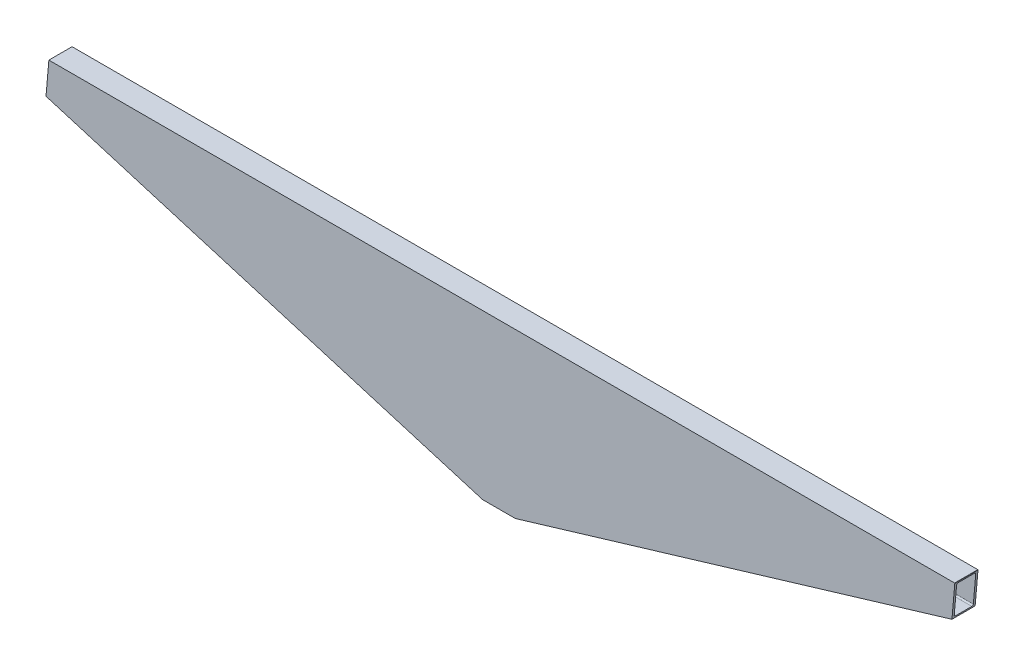
ISO-10303-21;
HEADER;
FILE_DESCRIPTION(('STEP AP214'),'2;1');
FILE_NAME('part.step','',(''),(''),'','','');
FILE_SCHEMA(('AUTOMOTIVE_DESIGN { 1 0 10303 214 1 1 1 1 }'));
ENDSEC;
DATA;
#1=APPLICATION_CONTEXT('core data for automotive mechanical design processes');
#2=APPLICATION_PROTOCOL_DEFINITION('international standard','automotive_design',2000,#1);
#3=PRODUCT_CONTEXT('',#1,'mechanical');
#4=PRODUCT('Part','Part','',(#3));
#5=PRODUCT_RELATED_PRODUCT_CATEGORY('part','',(#4));
#6=PRODUCT_DEFINITION_FORMATION('','',#4);
#7=PRODUCT_DEFINITION_CONTEXT('part definition',#1,'design');
#8=PRODUCT_DEFINITION('design','',#6,#7);
#9=PRODUCT_DEFINITION_SHAPE('','',#8);
#10=(LENGTH_UNIT() NAMED_UNIT(*) SI_UNIT(.MILLI.,.METRE.));
#11=(NAMED_UNIT(*) PLANE_ANGLE_UNIT() SI_UNIT($,.RADIAN.));
#12=(NAMED_UNIT(*) SI_UNIT($,.STERADIAN.) SOLID_ANGLE_UNIT());
#13=UNCERTAINTY_MEASURE_WITH_UNIT(LENGTH_MEASURE(1.E-05),#10,'distance_accuracy_value','');
#14=(GEOMETRIC_REPRESENTATION_CONTEXT(3) GLOBAL_UNCERTAINTY_ASSIGNED_CONTEXT((#13)) GLOBAL_UNIT_ASSIGNED_CONTEXT((#10,
#11,#12)) REPRESENTATION_CONTEXT('',''));
#15=CARTESIAN_POINT('',(0.,0.,0.));
#16=DIRECTION('',(0.,0.,1.));
#17=DIRECTION('',(1.,0.,0.));
#18=AXIS2_PLACEMENT_3D('',#15,#16,#17);
#19=CARTESIAN_POINT('',(4214.8777653,0.,0.));
#20=DIRECTION('',(0.,1.,0.));
#21=DIRECTION('',(0.,0.,1.));
#22=AXIS2_PLACEMENT_3D('',#19,#20,#21);
#23=PLANE('',#22);
#24=DIRECTION('',(0.,0.,-1.));
#25=VECTOR('',#24,1.);
#26=CARTESIAN_POINT('',(2017.90561032865,0.,101.6));
#27=LINE('',#26,#25);
#28=CARTESIAN_POINT('',(2017.90561032865,0.,101.6));
#29=VERTEX_POINT('',#28);
#30=CARTESIAN_POINT('',(2017.90561032865,0.,0.));
#31=VERTEX_POINT('',#30);
#32=EDGE_CURVE('E350',#29,#31,#27,.T.);
#33=ORIENTED_EDGE('',*,*,#32,.F.);
#34=DIRECTION('',(-1.,0.,0.));
#35=VECTOR('',#34,1.);
#36=CARTESIAN_POINT('',(4214.8777653,0.,101.6));
#37=LINE('',#36,#35);
#38=CARTESIAN_POINT('',(-13.3332723213508,0.,101.6));
#39=VERTEX_POINT('',#38);
#40=EDGE_CURVE('E434',#29,#39,#37,.T.);
#41=ORIENTED_EDGE('',*,*,#40,.T.);
#42=DIRECTION('',(0.,0.,-1.));
#43=VECTOR('',#42,1.);
#44=CARTESIAN_POINT('',(-13.3332723213509,0.,0.));
#45=LINE('',#44,#43);
#46=CARTESIAN_POINT('',(-13.3332723213509,0.,0.));
#47=VERTEX_POINT('',#46);
#48=EDGE_CURVE('E392',#39,#47,#45,.T.);
#49=ORIENTED_EDGE('',*,*,#48,.T.);
#50=DIRECTION('',(-1.,0.,0.));
#51=VECTOR('',#50,1.);
#52=CARTESIAN_POINT('',(4214.8777653,0.,0.));
#53=LINE('',#52,#51);
#54=EDGE_CURVE('E56',#31,#47,#53,.T.);
#55=ORIENTED_EDGE('',*,*,#54,.F.);
#56=EDGE_LOOP('',(#33,#41,#49,#55));
#57=FACE_BOUND('',#56,.T.);
#58=ADVANCED_FACE('F33',(#57),#23,.F.);
#59=DIRECTION('',(0.,0.,1.));
#60=VECTOR('',#59,1.);
#61=CARTESIAN_POINT('',(2170.30561032865,0.,101.6));
#62=LINE('',#61,#60);
#63=CARTESIAN_POINT('',(2170.30561032865,0.,0.));
#64=VERTEX_POINT('',#63);
#65=CARTESIAN_POINT('',(2170.30561032865,0.,101.6));
#66=VERTEX_POINT('',#65);
#67=EDGE_CURVE('E354',#64,#66,#62,.T.);
#68=ORIENTED_EDGE('',*,*,#67,.F.);
#69=CARTESIAN_POINT('',(4201.54449297865,0.,0.));
#70=VERTEX_POINT('',#69);
#71=EDGE_CURVE('E431',#70,#64,#53,.T.);
#72=ORIENTED_EDGE('',*,*,#71,.F.);
#73=DIRECTION('',(0.,0.,1.));
#74=VECTOR('',#73,1.);
#75=CARTESIAN_POINT('',(4201.54449297865,0.,0.));
#76=LINE('',#75,#74);
#77=CARTESIAN_POINT('',(4201.54449297865,0.,101.6));
#78=VERTEX_POINT('',#77);
#79=EDGE_CURVE('E394',#70,#78,#76,.T.);
#80=ORIENTED_EDGE('',*,*,#79,.T.);
#81=EDGE_CURVE('E435',#78,#66,#37,.T.);
#82=ORIENTED_EDGE('',*,*,#81,.T.);
#83=EDGE_LOOP('',(#68,#72,#80,#82));
#84=FACE_BOUND('',#83,.T.);
#85=ADVANCED_FACE('F468',(#84),#23,.F.);
#86=CARTESIAN_POINT('',(4214.8777653,152.4,0.));
#87=DIRECTION('',(0.,-1.,0.));
#88=DIRECTION('',(0.,0.,-1.));
#89=AXIS2_PLACEMENT_3D('',#86,#87,#88);
#90=PLANE('',#89);
#91=DIRECTION('',(0.,0.,1.));
#92=VECTOR('',#91,1.);
#93=CARTESIAN_POINT('',(0.,152.4,0.));
#94=LINE('',#93,#92);
#95=CARTESIAN_POINT('',(0.,152.4,-3.175));
#96=VERTEX_POINT('',#95);
#97=CARTESIAN_POINT('',(0.,152.4,104.775));
#98=VERTEX_POINT('',#97);
#99=EDGE_CURVE('E429',#96,#98,#94,.T.);
#100=ORIENTED_EDGE('',*,*,#99,.T.);
#101=DIRECTION('',(-1.,0.,0.));
#102=VECTOR('',#101,1.);
#103=CARTESIAN_POINT('',(4213.78645679893,152.4,104.775));
#104=LINE('',#103,#102);
#105=CARTESIAN_POINT('',(4213.78645679893,152.4,104.775));
#106=VERTEX_POINT('',#105);
#107=EDGE_CURVE('E455',#106,#98,#104,.T.);
#108=ORIENTED_EDGE('',*,*,#107,.F.);
#109=DIRECTION('',(0.,0.,1.));
#110=VECTOR('',#109,1.);
#111=CARTESIAN_POINT('',(4213.78645679893,152.4,0.));
#112=LINE('',#111,#110);
#113=CARTESIAN_POINT('',(4213.78645679893,152.4,-3.175));
#114=VERTEX_POINT('',#113);
#115=EDGE_CURVE('E11',#106,#114,#112,.F.);
#116=ORIENTED_EDGE('',*,*,#115,.T.);
#117=DIRECTION('',(1.,0.,0.));
#118=VECTOR('',#117,1.);
#119=CARTESIAN_POINT('',(0.,152.4,-3.175));
#120=LINE('',#119,#118);
#121=EDGE_CURVE('E271',#96,#114,#120,.T.);
#122=ORIENTED_EDGE('',*,*,#121,.F.);
#123=EDGE_LOOP('',(#100,#108,#116,#122));
#124=FACE_BOUND('',#123,.T.);
#125=ADVANCED_FACE('F486',(#124),#90,.F.);
#126=CARTESIAN_POINT('',(4214.8777653,12.7,88.9));
#127=DIRECTION('',(-1.,0.,0.));
#128=DIRECTION('',(0.,0.,1.));
#129=AXIS2_PLACEMENT_3D('',#126,#127,#128);
#130=CYLINDRICAL_SURFACE('',#129,6.35);
#131=CARTESIAN_POINT('',(4202.65559900543,12.7,88.9));
#132=DIRECTION('',(-0.996194698091746,0.0871557427476511,0.));
#133=DIRECTION('',(-0.0871557427476511,-0.996194698091746,0.));
#134=AXIS2_PLACEMENT_3D('',#131,#132,#133);
#135=ELLIPSE('',#134,6.37425596840025,6.35);
#136=CARTESIAN_POINT('',(4202.10004599204,6.34999999999999,88.9));
#137=VERTEX_POINT('',#136);
#138=CARTESIAN_POINT('',(4202.65559900543,12.7,95.25));
#139=VERTEX_POINT('',#138);
#140=EDGE_CURVE('E411',#137,#139,#135,.T.);
#141=ORIENTED_EDGE('',*,*,#140,.F.);
#142=DIRECTION('',(-1.,0.,0.));
#143=VECTOR('',#142,1.);
#144=CARTESIAN_POINT('',(4214.8777653,6.34999999999999,88.9));
#145=LINE('',#144,#143);
#146=CARTESIAN_POINT('',(-12.7777193079612,6.35000000000001,88.9));
#147=VERTEX_POINT('',#146);
#148=EDGE_CURVE('E427',#137,#147,#145,.T.);
#149=ORIENTED_EDGE('',*,*,#148,.T.);
#150=CARTESIAN_POINT('',(-12.2221662945716,12.7,88.9));
#151=DIRECTION('',(0.996194698091746,-0.0871557427476584,0.));
#152=DIRECTION('',(0.0871557427476584,0.996194698091746,0.));
#153=AXIS2_PLACEMENT_3D('',#150,#151,#152);
#154=ELLIPSE('',#153,6.37425596840025,6.35);
#155=CARTESIAN_POINT('',(-12.2221662945716,12.7,95.25));
#156=VERTEX_POINT('',#155);
#157=EDGE_CURVE('E370',#156,#147,#154,.T.);
#158=ORIENTED_EDGE('',*,*,#157,.F.);
#159=DIRECTION('',(-1.,0.,0.));
#160=VECTOR('',#159,1.);
#161=CARTESIAN_POINT('',(4214.8777653,12.7,95.25));
#162=LINE('',#161,#160);
#163=EDGE_CURVE('E413',#139,#156,#162,.T.);
#164=ORIENTED_EDGE('',*,*,#163,.F.);
#165=EDGE_LOOP('',(#141,#149,#158,#164));
#166=FACE_BOUND('',#165,.T.);
#167=ADVANCED_FACE('F617',(#166),#130,.F.);
#168=CARTESIAN_POINT('',(4214.8777653,6.35,12.7));
#169=DIRECTION('',(0.,1.,0.));
#170=DIRECTION('',(0.,0.,1.));
#171=AXIS2_PLACEMENT_3D('',#168,#169,#170);
#172=PLANE('',#171);
#173=DIRECTION('',(0.,0.,1.));
#174=VECTOR('',#173,1.);
#175=CARTESIAN_POINT('',(4202.10004599204,6.35,12.7));
#176=LINE('',#175,#174);
#177=CARTESIAN_POINT('',(4202.10004599204,6.35,12.7));
#178=VERTEX_POINT('',#177);
#179=EDGE_CURVE('E409',#178,#137,#176,.T.);
#180=ORIENTED_EDGE('',*,*,#179,.F.);
#181=DIRECTION('',(-1.,0.,0.));
#182=VECTOR('',#181,1.);
#183=CARTESIAN_POINT('',(4214.8777653,6.35,12.7));
#184=LINE('',#183,#182);
#185=CARTESIAN_POINT('',(-12.7777193079612,6.35,12.7));
#186=VERTEX_POINT('',#185);
#187=EDGE_CURVE('E425',#178,#186,#184,.T.);
#188=ORIENTED_EDGE('',*,*,#187,.T.);
#189=DIRECTION('',(0.,0.,-1.));
#190=VECTOR('',#189,1.);
#191=CARTESIAN_POINT('',(-12.7777193079612,6.35,12.7));
#192=LINE('',#191,#190);
#193=EDGE_CURVE('E373',#147,#186,#192,.T.);
#194=ORIENTED_EDGE('',*,*,#193,.F.);
#195=ORIENTED_EDGE('',*,*,#148,.F.);
#196=EDGE_LOOP('',(#180,#188,#194,#195));
#197=FACE_BOUND('',#196,.T.);
#198=ADVANCED_FACE('F614',(#197),#172,.T.);
#199=CARTESIAN_POINT('',(4214.8777653,12.7,12.7));
#200=DIRECTION('',(-1.,0.,0.));
#201=DIRECTION('',(0.,0.,1.));
#202=AXIS2_PLACEMENT_3D('',#199,#200,#201);
#203=CYLINDRICAL_SURFACE('',#202,6.35);
#204=CARTESIAN_POINT('',(4202.65559900543,12.7,12.7));
#205=DIRECTION('',(-0.996194698091746,0.0871557427476511,0.));
#206=DIRECTION('',(-0.0871557427476511,-0.996194698091746,0.));
#207=AXIS2_PLACEMENT_3D('',#204,#205,#206);
#208=ELLIPSE('',#207,6.37425596840025,6.35);
#209=CARTESIAN_POINT('',(4202.65559900543,12.7,6.35));
#210=VERTEX_POINT('',#209);
#211=EDGE_CURVE('E407',#210,#178,#208,.T.);
#212=ORIENTED_EDGE('',*,*,#211,.F.);
#213=DIRECTION('',(-1.,0.,0.));
#214=VECTOR('',#213,1.);
#215=CARTESIAN_POINT('',(4214.8777653,12.7,6.35));
#216=LINE('',#215,#214);
#217=CARTESIAN_POINT('',(-12.2221662945716,12.7,6.35000000000002));
#218=VERTEX_POINT('',#217);
#219=EDGE_CURVE('E423',#210,#218,#216,.T.);
#220=ORIENTED_EDGE('',*,*,#219,.T.);
#221=CARTESIAN_POINT('',(-12.2221662945716,12.7,12.7));
#222=DIRECTION('',(0.996194698091746,-0.0871557427476584,0.));
#223=DIRECTION('',(0.0871557427476584,0.996194698091746,0.));
#224=AXIS2_PLACEMENT_3D('',#221,#222,#223);
#225=ELLIPSE('',#224,6.37425596840025,6.35);
#226=EDGE_CURVE('E376',#186,#218,#225,.T.);
#227=ORIENTED_EDGE('',*,*,#226,.F.);
#228=ORIENTED_EDGE('',*,*,#187,.F.);
#229=EDGE_LOOP('',(#212,#220,#227,#228));
#230=FACE_BOUND('',#229,.T.);
#231=ADVANCED_FACE('F610',(#230),#203,.F.);
#232=CARTESIAN_POINT('',(4214.8777653,12.7,6.35));
#233=DIRECTION('',(0.,0.,1.));
#234=DIRECTION('',(0.,-1.,0.));
#235=AXIS2_PLACEMENT_3D('',#232,#233,#234);
#236=PLANE('',#235);
#237=DIRECTION('',(-0.0871557427476511,-0.996194698091746,0.));
#238=VECTOR('',#237,1.);
#239=CARTESIAN_POINT('',(4202.74844008997,13.7611784520971,6.35));
#240=LINE('',#239,#238);
#241=CARTESIAN_POINT('',(4213.76665927322,139.7,6.34999999999999));
#242=VERTEX_POINT('',#241);
#243=EDGE_CURVE('E405',#242,#210,#240,.T.);
#244=ORIENTED_EDGE('',*,*,#243,.F.);
#245=DIRECTION('',(-1.,0.,0.));
#246=VECTOR('',#245,1.);
#247=CARTESIAN_POINT('',(4214.8777653,139.7,6.34999999999999));
#248=LINE('',#247,#246);
#249=CARTESIAN_POINT('',(-1.11110602677923,139.7,6.35));
#250=VERTEX_POINT('',#249);
#251=EDGE_CURVE('E421',#242,#250,#248,.T.);
#252=ORIENTED_EDGE('',*,*,#251,.T.);
#253=DIRECTION('',(0.0871557427476584,0.996194698091746,0.));
#254=VECTOR('',#253,1.);
#255=CARTESIAN_POINT('',(-2.54728503804411,123.284398785114,6.35));
#256=LINE('',#255,#254);
#257=EDGE_CURVE('E379',#218,#250,#256,.T.);
#258=ORIENTED_EDGE('',*,*,#257,.F.);
#259=ORIENTED_EDGE('',*,*,#219,.F.);
#260=EDGE_LOOP('',(#244,#252,#258,#259));
#261=FACE_BOUND('',#260,.T.);
#262=ADVANCED_FACE('F606',(#261),#236,.T.);
#263=CARTESIAN_POINT('',(4214.8777653,139.7,12.7));
#264=DIRECTION('',(-1.,0.,0.));
#265=DIRECTION('',(0.,0.,1.));
#266=AXIS2_PLACEMENT_3D('',#263,#264,#265);
#267=CYLINDRICAL_SURFACE('',#266,6.35000000000001);
#268=CARTESIAN_POINT('',(4213.76665927322,139.7,12.7));
#269=DIRECTION('',(-0.996194698091746,0.0871557427476511,0.));
#270=DIRECTION('',(-0.0871557427476511,-0.996194698091746,0.));
#271=AXIS2_PLACEMENT_3D('',#268,#269,#270);
#272=ELLIPSE('',#271,6.37425596840026,6.35000000000001);
#273=CARTESIAN_POINT('',(4214.32221228661,146.05,12.7));
#274=VERTEX_POINT('',#273);
#275=EDGE_CURVE('E403',#274,#242,#272,.T.);
#276=ORIENTED_EDGE('',*,*,#275,.F.);
#277=DIRECTION('',(-1.,0.,0.));
#278=VECTOR('',#277,1.);
#279=CARTESIAN_POINT('',(4214.8777653,146.05,12.7));
#280=LINE('',#279,#278);
#281=CARTESIAN_POINT('',(-0.555553013389609,146.05,12.7));
#282=VERTEX_POINT('',#281);
#283=EDGE_CURVE('E419',#274,#282,#280,.T.);
#284=ORIENTED_EDGE('',*,*,#283,.T.);
#285=CARTESIAN_POINT('',(-1.11110602677925,139.7,12.7));
#286=DIRECTION('',(0.996194698091746,-0.0871557427476584,0.));
#287=DIRECTION('',(0.0871557427476584,0.996194698091746,0.));
#288=AXIS2_PLACEMENT_3D('',#285,#286,#287);
#289=ELLIPSE('',#288,6.37425596840025,6.35);
#290=EDGE_CURVE('E382',#250,#282,#289,.T.);
#291=ORIENTED_EDGE('',*,*,#290,.F.);
#292=ORIENTED_EDGE('',*,*,#251,.F.);
#293=EDGE_LOOP('',(#276,#284,#291,#292));
#294=FACE_BOUND('',#293,.T.);
#295=ADVANCED_FACE('F602',(#294),#267,.F.);
#296=CARTESIAN_POINT('',(4214.8777653,146.05,12.7));
#297=DIRECTION('',(0.,-1.,0.));
#298=DIRECTION('',(0.,0.,-1.));
#299=AXIS2_PLACEMENT_3D('',#296,#297,#298);
#300=PLANE('',#299);
#301=DIRECTION('',(0.,0.,-1.));
#302=VECTOR('',#301,1.);
#303=CARTESIAN_POINT('',(4214.32221228661,146.05,12.7));
#304=LINE('',#303,#302);
#305=CARTESIAN_POINT('',(4214.32221228661,146.05,88.9));
#306=VERTEX_POINT('',#305);
#307=EDGE_CURVE('E401',#306,#274,#304,.T.);
#308=ORIENTED_EDGE('',*,*,#307,.F.);
#309=DIRECTION('',(-1.,0.,0.));
#310=VECTOR('',#309,1.);
#311=CARTESIAN_POINT('',(4214.8777653,146.05,88.9));
#312=LINE('',#311,#310);
#313=CARTESIAN_POINT('',(-0.555553013389609,146.05,88.9));
#314=VERTEX_POINT('',#313);
#315=EDGE_CURVE('E417',#306,#314,#312,.T.);
#316=ORIENTED_EDGE('',*,*,#315,.T.);
#317=DIRECTION('',(0.,0.,1.));
#318=VECTOR('',#317,1.);
#319=CARTESIAN_POINT('',(-0.555553013389609,146.05,88.9));
#320=LINE('',#319,#318);
#321=EDGE_CURVE('E385',#282,#314,#320,.T.);
#322=ORIENTED_EDGE('',*,*,#321,.F.);
#323=ORIENTED_EDGE('',*,*,#283,.F.);
#324=EDGE_LOOP('',(#308,#316,#322,#323));
#325=FACE_BOUND('',#324,.T.);
#326=ADVANCED_FACE('F598',(#325),#300,.T.);
#327=CARTESIAN_POINT('',(4214.8777653,139.7,88.9));
#328=DIRECTION('',(-1.,0.,0.));
#329=DIRECTION('',(0.,0.,1.));
#330=AXIS2_PLACEMENT_3D('',#327,#328,#329);
#331=CYLINDRICAL_SURFACE('',#330,6.34999999999999);
#332=CARTESIAN_POINT('',(4213.76665927322,139.7,88.9));
#333=DIRECTION('',(-0.996194698091746,0.0871557427476511,0.));
#334=DIRECTION('',(-0.0871557427476511,-0.996194698091746,0.));
#335=AXIS2_PLACEMENT_3D('',#332,#333,#334);
#336=ELLIPSE('',#335,6.37425596840025,6.34999999999999);
#337=CARTESIAN_POINT('',(4213.76665927322,139.7,95.25));
#338=VERTEX_POINT('',#337);
#339=EDGE_CURVE('E399',#338,#306,#336,.T.);
#340=ORIENTED_EDGE('',*,*,#339,.F.);
#341=DIRECTION('',(-1.,0.,0.));
#342=VECTOR('',#341,1.);
#343=CARTESIAN_POINT('',(4214.8777653,139.7,95.25));
#344=LINE('',#343,#342);
#345=CARTESIAN_POINT('',(-1.11110602677923,139.7,95.25));
#346=VERTEX_POINT('',#345);
#347=EDGE_CURVE('E415',#338,#346,#344,.T.);
#348=ORIENTED_EDGE('',*,*,#347,.T.);
#349=CARTESIAN_POINT('',(-1.11110602677925,139.7,88.9));
#350=DIRECTION('',(0.996194698091746,-0.0871557427476584,0.));
#351=DIRECTION('',(0.0871557427476584,0.996194698091746,0.));
#352=AXIS2_PLACEMENT_3D('',#349,#350,#351);
#353=ELLIPSE('',#352,6.37425596840024,6.34999999999998);
#354=EDGE_CURVE('E388',#314,#346,#353,.T.);
#355=ORIENTED_EDGE('',*,*,#354,.F.);
#356=ORIENTED_EDGE('',*,*,#315,.F.);
#357=EDGE_LOOP('',(#340,#348,#355,#356));
#358=FACE_BOUND('',#357,.T.);
#359=ADVANCED_FACE('F594',(#358),#331,.F.);
#360=CARTESIAN_POINT('',(4214.8777653,12.7,95.25));
#361=DIRECTION('',(0.,0.,-1.));
#362=DIRECTION('',(-1.,0.,0.));
#363=AXIS2_PLACEMENT_3D('',#360,#361,#362);
#364=PLANE('',#363);
#365=DIRECTION('',(0.0871557427476511,0.996194698091746,0.));
#366=VECTOR('',#365,1.);
#367=CARTESIAN_POINT('',(4202.74844008997,13.7611784520971,95.25));
#368=LINE('',#367,#366);
#369=EDGE_CURVE('E438',#139,#338,#368,.T.);
#370=ORIENTED_EDGE('',*,*,#369,.F.);
#371=ORIENTED_EDGE('',*,*,#163,.T.);
#372=DIRECTION('',(-0.0871557427476584,-0.996194698091746,0.));
#373=VECTOR('',#372,1.);
#374=CARTESIAN_POINT('',(-13.5739443198942,-2.7508935311608,95.25));
#375=LINE('',#374,#373);
#376=EDGE_CURVE('E391',#346,#156,#375,.T.);
#377=ORIENTED_EDGE('',*,*,#376,.F.);
#378=ORIENTED_EDGE('',*,*,#347,.F.);
#379=EDGE_LOOP('',(#370,#371,#377,#378));
#380=FACE_BOUND('',#379,.T.);
#381=ADVANCED_FACE('F590',(#380),#364,.T.);
#382=CARTESIAN_POINT('',(4214.8777653,152.4,0.));
#383=DIRECTION('',(-0.996194698091746,0.0871557427476511,0.));
#384=DIRECTION('',(-0.0871557427476511,-0.996194698091746,0.));
#385=AXIS2_PLACEMENT_3D('',#382,#383,#384);
#386=PLANE('',#385);
#387=ORIENTED_EDGE('',*,*,#140,.T.);
#388=ORIENTED_EDGE('',*,*,#369,.T.);
#389=ORIENTED_EDGE('',*,*,#339,.T.);
#390=ORIENTED_EDGE('',*,*,#307,.T.);
#391=ORIENTED_EDGE('',*,*,#275,.T.);
#392=ORIENTED_EDGE('',*,*,#243,.T.);
#393=ORIENTED_EDGE('',*,*,#211,.T.);
#394=ORIENTED_EDGE('',*,*,#179,.T.);
#395=EDGE_LOOP('',(#387,#388,#389,#390,#391,#392,#393,#394));
#396=FACE_BOUND('',#395,.T.);
#397=ORIENTED_EDGE('',*,*,#79,.F.);
#398=DIRECTION('',(0.,0.,1.));
#399=VECTOR('',#398,1.);
#400=CARTESIAN_POINT('',(4201.54449297865,0.,-3.175));
#401=LINE('',#400,#399);
#402=CARTESIAN_POINT('',(4201.54449297865,0.,-3.175));
#403=VERTEX_POINT('',#402);
#404=EDGE_CURVE('E278',#403,#70,#401,.T.);
#405=ORIENTED_EDGE('',*,*,#404,.F.);
#406=DIRECTION('',(-0.0871557427476502,-0.996194698091746,0.));
#407=VECTOR('',#406,1.);
#408=CARTESIAN_POINT('',(4214.78265149702,151.312844257252,-3.175));
#409=LINE('',#408,#407);
#410=CARTESIAN_POINT('',(4214.78265149702,151.312844257252,-3.175));
#411=VERTEX_POINT('',#410);
#412=EDGE_CURVE('E277',#411,#403,#409,.T.);
#413=ORIENTED_EDGE('',*,*,#412,.F.);
#414=DIRECTION('',(0.,0.,1.));
#415=VECTOR('',#414,1.);
#416=CARTESIAN_POINT('',(4214.78265149702,151.312844257252,0.));
#417=LINE('',#416,#415);
#418=CARTESIAN_POINT('',(4214.78265149702,151.312844257251,104.775));
#419=VERTEX_POINT('',#418);
#420=EDGE_CURVE('E41',#411,#419,#417,.T.);
#421=ORIENTED_EDGE('',*,*,#420,.T.);
#422=DIRECTION('',(0.0871557427476569,0.996194698091746,0.));
#423=VECTOR('',#422,1.);
#424=CARTESIAN_POINT('',(4201.54449297865,0.,104.775));
#425=LINE('',#424,#423);
#426=CARTESIAN_POINT('',(4201.54449297865,0.,104.775));
#427=VERTEX_POINT('',#426);
#428=EDGE_CURVE('E445',#427,#419,#425,.T.);
#429=ORIENTED_EDGE('',*,*,#428,.F.);
#430=DIRECTION('',(0.,0.,-1.));
#431=VECTOR('',#430,1.);
#432=CARTESIAN_POINT('',(4201.54449297865,0.,104.775));
#433=LINE('',#432,#431);
#434=EDGE_CURVE('E257',#427,#78,#433,.T.);
#435=ORIENTED_EDGE('',*,*,#434,.T.);
#436=EDGE_LOOP('',(#397,#405,#413,#421,#429,#435));
#437=FACE_BOUND('',#436,.T.);
#438=ADVANCED_FACE('F443',(#396,#437),#386,.F.);
#439=CARTESIAN_POINT('',(-13.2319911382201,1.15764922046975,0.));
#440=DIRECTION('',(0.996194698091746,-0.0871557427476584,0.));
#441=DIRECTION('',(0.0871557427476584,0.996194698091746,0.));
#442=AXIS2_PLACEMENT_3D('',#439,#440,#441);
#443=PLANE('',#442);
#444=ORIENTED_EDGE('',*,*,#354,.T.);
#445=ORIENTED_EDGE('',*,*,#376,.T.);
#446=ORIENTED_EDGE('',*,*,#157,.T.);
#447=ORIENTED_EDGE('',*,*,#193,.T.);
#448=ORIENTED_EDGE('',*,*,#226,.T.);
#449=ORIENTED_EDGE('',*,*,#257,.T.);
#450=ORIENTED_EDGE('',*,*,#290,.T.);
#451=ORIENTED_EDGE('',*,*,#321,.T.);
#452=EDGE_LOOP('',(#444,#445,#446,#447,#448,#449,#450,#451));
#453=FACE_BOUND('',#452,.T.);
#454=ORIENTED_EDGE('',*,*,#99,.F.);
#455=DIRECTION('',(0.0871557427476585,0.996194698091746,0.));
#456=VECTOR('',#455,1.);
#457=CARTESIAN_POINT('',(-13.3332723213509,0.,-3.175));
#458=LINE('',#457,#456);
#459=CARTESIAN_POINT('',(-13.3332723213509,0.,-3.175));
#460=VERTEX_POINT('',#459);
#461=EDGE_CURVE('E268',#460,#96,#458,.T.);
#462=ORIENTED_EDGE('',*,*,#461,.F.);
#463=DIRECTION('',(0.,0.,1.));
#464=VECTOR('',#463,1.);
#465=CARTESIAN_POINT('',(-13.3332723213509,0.,-3.175));
#466=LINE('',#465,#464);
#467=EDGE_CURVE('E284',#460,#47,#466,.T.);
#468=ORIENTED_EDGE('',*,*,#467,.T.);
#469=ORIENTED_EDGE('',*,*,#48,.F.);
#470=DIRECTION('',(0.,0.,-1.));
#471=VECTOR('',#470,1.);
#472=CARTESIAN_POINT('',(-13.3332723213508,0.,104.775));
#473=LINE('',#472,#471);
#474=CARTESIAN_POINT('',(-13.3332723213508,0.,104.775));
#475=VERTEX_POINT('',#474);
#476=EDGE_CURVE('E461',#475,#39,#473,.T.);
#477=ORIENTED_EDGE('',*,*,#476,.F.);
#478=DIRECTION('',(-0.0871557427476583,-0.996194698091746,0.));
#479=VECTOR('',#478,1.);
#480=CARTESIAN_POINT('',(0.,152.4,104.775));
#481=LINE('',#480,#479);
#482=EDGE_CURVE('E243',#98,#475,#481,.T.);
#483=ORIENTED_EDGE('',*,*,#482,.F.);
#484=EDGE_LOOP('',(#454,#462,#468,#469,#477,#483));
#485=FACE_BOUND('',#484,.T.);
#486=ADVANCED_FACE('F488',(#453,#485),#443,.F.);
#487=CARTESIAN_POINT('',(4213.78645679893,151.4,0.));
#488=DIRECTION('',(0.,0.,1.));
#489=DIRECTION('',(0.,-1.,0.));
#490=AXIS2_PLACEMENT_3D('',#487,#488,#489);
#491=CYLINDRICAL_SURFACE('',#490,1.);
#492=ORIENTED_EDGE('',*,*,#420,.F.);
#493=CARTESIAN_POINT('',(4213.78645679893,151.399999999999,-3.175));
#494=DIRECTION('',(0.,0.,-1.));
#495=DIRECTION('',(-1.,0.,0.));
#496=AXIS2_PLACEMENT_3D('',#493,#494,#495);
#497=CIRCLE('',#496,1.00000000000052);
#498=EDGE_CURVE('E274',#114,#411,#497,.T.);
#499=ORIENTED_EDGE('',*,*,#498,.F.);
#500=ORIENTED_EDGE('',*,*,#115,.F.);
#501=CARTESIAN_POINT('',(4213.78645679893,151.4,104.775));
#502=DIRECTION('',(0.,0.,1.));
#503=DIRECTION('',(1.,0.,0.));
#504=AXIS2_PLACEMENT_3D('',#501,#502,#503);
#505=CIRCLE('',#504,1.00000000000028);
#506=EDGE_CURVE('E451',#419,#106,#505,.T.);
#507=ORIENTED_EDGE('',*,*,#506,.F.);
#508=EDGE_LOOP('',(#492,#499,#500,#507));
#509=FACE_BOUND('',#508,.T.);
#510=ADVANCED_FACE('F35',(#509),#491,.T.);
#511=CARTESIAN_POINT('',(0.,-609.6,-1.11981703314303E-13));
#512=DIRECTION('',(0.,-1.,0.));
#513=DIRECTION('',(0.,0.,-1.));
#514=AXIS2_PLACEMENT_3D('',#511,#512,#513);
#515=PLANE('',#514);
#516=DIRECTION('',(0.,0.,-1.));
#517=VECTOR('',#516,1.);
#518=CARTESIAN_POINT('',(2017.90561032865,-609.6,101.6));
#519=LINE('',#518,#517);
#520=CARTESIAN_POINT('',(2017.90561032865,-609.6,101.6));
#521=VERTEX_POINT('',#520);
#522=CARTESIAN_POINT('',(2017.90561032865,-609.6,-1.58640746361811E-13));
#523=VERTEX_POINT('',#522);
#524=EDGE_CURVE('E351',#521,#523,#519,.T.);
#525=ORIENTED_EDGE('',*,*,#524,.T.);
#526=DIRECTION('',(0.,0.,1.));
#527=VECTOR('',#526,1.);
#528=CARTESIAN_POINT('',(2017.90561032865,-609.6,-3.175));
#529=LINE('',#528,#527);
#530=CARTESIAN_POINT('',(2017.90561032865,-609.6,-3.175));
#531=VERTEX_POINT('',#530);
#532=EDGE_CURVE('E287',#531,#523,#529,.T.);
#533=ORIENTED_EDGE('',*,*,#532,.F.);
#534=DIRECTION('',(-1.,0.,0.));
#535=VECTOR('',#534,1.);
#536=CARTESIAN_POINT('',(2170.30561032865,-609.6,-3.175));
#537=LINE('',#536,#535);
#538=CARTESIAN_POINT('',(2170.30561032865,-609.6,-3.175));
#539=VERTEX_POINT('',#538);
#540=EDGE_CURVE('E264',#539,#531,#537,.T.);
#541=ORIENTED_EDGE('',*,*,#540,.F.);
#542=DIRECTION('',(0.,0.,1.));
#543=VECTOR('',#542,1.);
#544=CARTESIAN_POINT('',(2170.30561032865,-609.6,-3.175));
#545=LINE('',#544,#543);
#546=CARTESIAN_POINT('',(2170.30561032865,-609.6,-1.11981703314303E-13));
#547=VERTEX_POINT('',#546);
#548=EDGE_CURVE('E290',#539,#547,#545,.T.);
#549=ORIENTED_EDGE('',*,*,#548,.T.);
#550=DIRECTION('',(0.,0.,1.));
#551=VECTOR('',#550,1.);
#552=CARTESIAN_POINT('',(2170.30561032865,-609.6,101.6));
#553=LINE('',#552,#551);
#554=CARTESIAN_POINT('',(2170.30561032865,-609.6,101.6));
#555=VERTEX_POINT('',#554);
#556=EDGE_CURVE('E353',#547,#555,#553,.T.);
#557=ORIENTED_EDGE('',*,*,#556,.T.);
#558=DIRECTION('',(0.,0.,-1.));
#559=VECTOR('',#558,1.);
#560=CARTESIAN_POINT('',(2170.30561032865,-609.6,104.775));
#561=LINE('',#560,#559);
#562=CARTESIAN_POINT('',(2170.30561032865,-609.6,104.775));
#563=VERTEX_POINT('',#562);
#564=EDGE_CURVE('E233',#563,#555,#561,.T.);
#565=ORIENTED_EDGE('',*,*,#564,.F.);
#566=DIRECTION('',(1.,0.,0.));
#567=VECTOR('',#566,1.);
#568=CARTESIAN_POINT('',(2017.90561032865,-609.6,104.775));
#569=LINE('',#568,#567);
#570=CARTESIAN_POINT('',(2017.90561032865,-609.6,104.775));
#571=VERTEX_POINT('',#570);
#572=EDGE_CURVE('E225',#571,#563,#569,.T.);
#573=ORIENTED_EDGE('',*,*,#572,.F.);
#574=DIRECTION('',(0.,0.,-1.));
#575=VECTOR('',#574,1.);
#576=CARTESIAN_POINT('',(2017.90561032865,-609.6,104.775));
#577=LINE('',#576,#575);
#578=EDGE_CURVE('E230',#571,#521,#577,.T.);
#579=ORIENTED_EDGE('',*,*,#578,.T.);
#580=EDGE_LOOP('',(#525,#533,#541,#549,#557,#565,#573,#579));
#581=FACE_BOUND('',#580,.T.);
#582=DIRECTION('',(1.,0.,0.));
#583=VECTOR('',#582,1.);
#584=CARTESIAN_POINT('',(2030.60561032865,-609.6,6.34999999999989));
#585=LINE('',#584,#583);
#586=CARTESIAN_POINT('',(2030.60561032865,-609.6,6.34999999999989));
#587=VERTEX_POINT('',#586);
#588=CARTESIAN_POINT('',(2157.60561032865,-609.6,6.34999999999999));
#589=VERTEX_POINT('',#588);
#590=EDGE_CURVE('E296',#587,#589,#585,.T.);
#591=ORIENTED_EDGE('',*,*,#590,.F.);
#592=CARTESIAN_POINT('',(2030.60561032865,-609.6,12.6999999999999));
#593=DIRECTION('',(0.,-1.,0.));
#594=DIRECTION('',(0.,0.,-1.));
#595=AXIS2_PLACEMENT_3D('',#592,#593,#594);
#596=CIRCLE('',#595,6.34999999999991);
#597=CARTESIAN_POINT('',(2024.25561032865,-609.6,12.6999999999999));
#598=VERTEX_POINT('',#597);
#599=EDGE_CURVE('E294',#598,#587,#596,.T.);
#600=ORIENTED_EDGE('',*,*,#599,.F.);
#601=DIRECTION('',(0.,0.,-1.));
#602=VECTOR('',#601,1.);
#603=CARTESIAN_POINT('',(2024.25561032865,-609.6,88.8999999999997));
#604=LINE('',#603,#602);
#605=CARTESIAN_POINT('',(2024.25561032865,-609.6,88.8999999999998));
#606=VERTEX_POINT('',#605);
#607=EDGE_CURVE('E310',#606,#598,#604,.T.);
#608=ORIENTED_EDGE('',*,*,#607,.F.);
#609=CARTESIAN_POINT('',(2030.60561032865,-609.6,88.8999999999997));
#610=DIRECTION('',(0.,-1.,0.));
#611=DIRECTION('',(0.,0.,1.));
#612=AXIS2_PLACEMENT_3D('',#609,#610,#611);
#613=CIRCLE('',#612,6.3499999999997);
#614=CARTESIAN_POINT('',(2030.60561032865,-609.6,95.2499999999994));
#615=VERTEX_POINT('',#614);
#616=EDGE_CURVE('E307',#615,#606,#613,.T.);
#617=ORIENTED_EDGE('',*,*,#616,.F.);
#618=DIRECTION('',(-1.,0.,0.));
#619=VECTOR('',#618,1.);
#620=CARTESIAN_POINT('',(2030.60561032865,-609.6,95.2499999999997));
#621=LINE('',#620,#619);
#622=CARTESIAN_POINT('',(2157.60561032865,-609.6,95.2499999999998));
#623=VERTEX_POINT('',#622);
#624=EDGE_CURVE('E305',#623,#615,#621,.T.);
#625=ORIENTED_EDGE('',*,*,#624,.F.);
#626=CARTESIAN_POINT('',(2157.60561032865,-609.6,88.8999999999998));
#627=DIRECTION('',(0.,-1.,0.));
#628=DIRECTION('',(0.,0.,-1.));
#629=AXIS2_PLACEMENT_3D('',#626,#627,#628);
#630=CIRCLE('',#629,6.3499999999997);
#631=CARTESIAN_POINT('',(2163.95561032865,-609.6,88.8999999999998));
#632=VERTEX_POINT('',#631);
#633=EDGE_CURVE('E303',#632,#623,#630,.T.);
#634=ORIENTED_EDGE('',*,*,#633,.F.);
#635=DIRECTION('',(0.,0.,1.));
#636=VECTOR('',#635,1.);
#637=CARTESIAN_POINT('',(2163.95561032865,-609.6,88.8999999999998));
#638=LINE('',#637,#636);
#639=CARTESIAN_POINT('',(2163.95561032865,-609.6,12.6999999999999));
#640=VERTEX_POINT('',#639);
#641=EDGE_CURVE('E301',#640,#632,#638,.T.);
#642=ORIENTED_EDGE('',*,*,#641,.F.);
#643=CARTESIAN_POINT('',(2157.60561032865,-609.6,12.6999999999999));
#644=DIRECTION('',(0.,-1.,0.));
#645=DIRECTION('',(0.,0.,-1.));
#646=AXIS2_PLACEMENT_3D('',#643,#644,#645);
#647=CIRCLE('',#646,6.34999999999991);
#648=EDGE_CURVE('E299',#589,#640,#647,.T.);
#649=ORIENTED_EDGE('',*,*,#648,.F.);
#650=EDGE_LOOP('',(#591,#600,#608,#617,#625,#634,#642,#649));
#651=FACE_BOUND('',#650,.T.);
#652=ADVANCED_FACE('F227',(#581,#651),#515,.T.);
#653=CARTESIAN_POINT('',(2017.90561032865,-609.6,101.6));
#654=DIRECTION('',(1.,0.,0.));
#655=DIRECTION('',(0.,1.,0.));
#656=AXIS2_PLACEMENT_3D('',#653,#654,#655);
#657=PLANE('',#656);
#658=ORIENTED_EDGE('',*,*,#32,.T.);
#659=DIRECTION('',(0.,1.,0.));
#660=VECTOR('',#659,1.);
#661=CARTESIAN_POINT('',(2017.90561032865,-609.6,-1.58640746361811E-13));
#662=LINE('',#661,#660);
#663=EDGE_CURVE('E367',#523,#31,#662,.T.);
#664=ORIENTED_EDGE('',*,*,#663,.F.);
#665=ORIENTED_EDGE('',*,*,#524,.F.);
#666=DIRECTION('',(0.,1.,0.));
#667=VECTOR('',#666,1.);
#668=CARTESIAN_POINT('',(2017.90561032865,-609.6,101.6));
#669=LINE('',#668,#667);
#670=EDGE_CURVE('E356',#521,#29,#669,.T.);
#671=ORIENTED_EDGE('',*,*,#670,.T.);
#672=EDGE_LOOP('',(#658,#664,#665,#671));
#673=FACE_BOUND('',#672,.T.);
#674=ADVANCED_FACE('F495',(#673),#657,.F.);
#675=CARTESIAN_POINT('',(2170.30561032865,-609.6,101.6));
#676=DIRECTION('',(-1.,0.,0.));
#677=DIRECTION('',(0.,-1.,0.));
#678=AXIS2_PLACEMENT_3D('',#675,#676,#677);
#679=PLANE('',#678);
#680=ORIENTED_EDGE('',*,*,#67,.T.);
#681=DIRECTION('',(0.,1.,0.));
#682=VECTOR('',#681,1.);
#683=CARTESIAN_POINT('',(2170.30561032865,-609.6,101.6));
#684=LINE('',#683,#682);
#685=EDGE_CURVE('E362',#555,#66,#684,.T.);
#686=ORIENTED_EDGE('',*,*,#685,.F.);
#687=ORIENTED_EDGE('',*,*,#556,.F.);
#688=DIRECTION('',(0.,1.,0.));
#689=VECTOR('',#688,1.);
#690=CARTESIAN_POINT('',(2170.30561032865,-609.6,-1.11981703314303E-13));
#691=LINE('',#690,#689);
#692=EDGE_CURVE('E364',#547,#64,#691,.T.);
#693=ORIENTED_EDGE('',*,*,#692,.T.);
#694=EDGE_LOOP('',(#680,#686,#687,#693));
#695=FACE_BOUND('',#694,.T.);
#696=ADVANCED_FACE('F578',(#695),#679,.F.);
#697=CARTESIAN_POINT('',(2030.60561032865,-609.6,12.6999999999999));
#698=DIRECTION('',(0.,1.,0.));
#699=DIRECTION('',(0.,0.,1.));
#700=AXIS2_PLACEMENT_3D('',#697,#698,#699);
#701=CYLINDRICAL_SURFACE('',#700,6.34999999999991);
#702=CARTESIAN_POINT('',(2030.60561032865,0.,12.7));
#703=DIRECTION('',(0.,-1.,0.));
#704=DIRECTION('',(0.,0.,-1.));
#705=AXIS2_PLACEMENT_3D('',#702,#703,#704);
#706=CIRCLE('',#705,6.34999999999991);
#707=CARTESIAN_POINT('',(2024.25561032865,0.,12.6999999999999));
#708=VERTEX_POINT('',#707);
#709=CARTESIAN_POINT('',(2030.60561032865,0.,6.35));
#710=VERTEX_POINT('',#709);
#711=EDGE_CURVE('E293',#708,#710,#706,.T.);
#712=ORIENTED_EDGE('',*,*,#711,.F.);
#713=DIRECTION('',(0.,1.,0.));
#714=VECTOR('',#713,1.);
#715=CARTESIAN_POINT('',(2024.25561032865,-609.6,12.6999999999999));
#716=LINE('',#715,#714);
#717=EDGE_CURVE('E48',#598,#708,#716,.T.);
#718=ORIENTED_EDGE('',*,*,#717,.F.);
#719=ORIENTED_EDGE('',*,*,#599,.T.);
#720=DIRECTION('',(0.,1.,0.));
#721=VECTOR('',#720,1.);
#722=CARTESIAN_POINT('',(2030.60561032865,-609.6,6.34999999999989));
#723=LINE('',#722,#721);
#724=EDGE_CURVE('E347',#587,#710,#723,.T.);
#725=ORIENTED_EDGE('',*,*,#724,.T.);
#726=EDGE_LOOP('',(#712,#718,#719,#725));
#727=FACE_BOUND('',#726,.T.);
#728=ADVANCED_FACE('F540',(#727),#701,.F.);
#729=CARTESIAN_POINT('',(2030.60561032865,-609.6,6.34999999999989));
#730=DIRECTION('',(0.,0.,1.));
#731=DIRECTION('',(1.,0.,0.));
#732=AXIS2_PLACEMENT_3D('',#729,#730,#731);
#733=PLANE('',#732);
#734=DIRECTION('',(1.,0.,0.));
#735=VECTOR('',#734,1.);
#736=CARTESIAN_POINT('',(2030.60561032865,0.,6.35));
#737=LINE('',#736,#735);
#738=CARTESIAN_POINT('',(2157.60561032865,0.,6.3500000000001));
#739=VERTEX_POINT('',#738);
#740=EDGE_CURVE('E314',#710,#739,#737,.T.);
#741=ORIENTED_EDGE('',*,*,#740,.F.);
#742=ORIENTED_EDGE('',*,*,#724,.F.);
#743=ORIENTED_EDGE('',*,*,#590,.T.);
#744=DIRECTION('',(0.,1.,0.));
#745=VECTOR('',#744,1.);
#746=CARTESIAN_POINT('',(2157.60561032865,-609.6,6.34999999999999));
#747=LINE('',#746,#745);
#748=EDGE_CURVE('E345',#589,#739,#747,.T.);
#749=ORIENTED_EDGE('',*,*,#748,.T.);
#750=EDGE_LOOP('',(#741,#742,#743,#749));
#751=FACE_BOUND('',#750,.T.);
#752=ADVANCED_FACE('F542',(#751),#733,.T.);
#753=CARTESIAN_POINT('',(2157.60561032865,-609.6,12.6999999999999));
#754=DIRECTION('',(0.,1.,0.));
#755=DIRECTION('',(0.,0.,1.));
#756=AXIS2_PLACEMENT_3D('',#753,#754,#755);
#757=CYLINDRICAL_SURFACE('',#756,6.34999999999991);
#758=CARTESIAN_POINT('',(2157.60561032865,0.,12.7));
#759=DIRECTION('',(0.,-1.,0.));
#760=DIRECTION('',(0.,0.,-1.));
#761=AXIS2_PLACEMENT_3D('',#758,#759,#760);
#762=CIRCLE('',#761,6.34999999999991);
#763=CARTESIAN_POINT('',(2163.95561032865,0.,12.7));
#764=VERTEX_POINT('',#763);
#765=EDGE_CURVE('E317',#739,#764,#762,.T.);
#766=ORIENTED_EDGE('',*,*,#765,.F.);
#767=ORIENTED_EDGE('',*,*,#748,.F.);
#768=ORIENTED_EDGE('',*,*,#648,.T.);
#769=DIRECTION('',(0.,1.,0.));
#770=VECTOR('',#769,1.);
#771=CARTESIAN_POINT('',(2163.95561032865,-609.6,12.6999999999999));
#772=LINE('',#771,#770);
#773=EDGE_CURVE('E343',#640,#764,#772,.T.);
#774=ORIENTED_EDGE('',*,*,#773,.T.);
#775=EDGE_LOOP('',(#766,#767,#768,#774));
#776=FACE_BOUND('',#775,.T.);
#777=ADVANCED_FACE('F547',(#776),#757,.F.);
#778=CARTESIAN_POINT('',(2163.95561032865,-609.6,88.8999999999998));
#779=DIRECTION('',(-1.,0.,0.));
#780=DIRECTION('',(0.,0.,1.));
#781=AXIS2_PLACEMENT_3D('',#778,#779,#780);
#782=PLANE('',#781);
#783=DIRECTION('',(0.,0.,1.));
#784=VECTOR('',#783,1.);
#785=CARTESIAN_POINT('',(2163.95561032865,0.,88.8999999999999));
#786=LINE('',#785,#784);
#787=CARTESIAN_POINT('',(2163.95561032865,0.,88.8999999999999));
#788=VERTEX_POINT('',#787);
#789=EDGE_CURVE('E320',#764,#788,#786,.T.);
#790=ORIENTED_EDGE('',*,*,#789,.F.);
#791=ORIENTED_EDGE('',*,*,#773,.F.);
#792=ORIENTED_EDGE('',*,*,#641,.T.);
#793=DIRECTION('',(0.,1.,0.));
#794=VECTOR('',#793,1.);
#795=CARTESIAN_POINT('',(2163.95561032865,-609.6,88.8999999999998));
#796=LINE('',#795,#794);
#797=EDGE_CURVE('E341',#632,#788,#796,.T.);
#798=ORIENTED_EDGE('',*,*,#797,.T.);
#799=EDGE_LOOP('',(#790,#791,#792,#798));
#800=FACE_BOUND('',#799,.T.);
#801=ADVANCED_FACE('F551',(#800),#782,.T.);
#802=CARTESIAN_POINT('',(2157.60561032865,-609.6,88.8999999999998));
#803=DIRECTION('',(0.,1.,0.));
#804=DIRECTION('',(0.,0.,1.));
#805=AXIS2_PLACEMENT_3D('',#802,#803,#804);
#806=CYLINDRICAL_SURFACE('',#805,6.3499999999997);
#807=CARTESIAN_POINT('',(2157.60561032865,0.,88.8999999999999));
#808=DIRECTION('',(0.,-1.,0.));
#809=DIRECTION('',(0.,0.,-1.));
#810=AXIS2_PLACEMENT_3D('',#807,#808,#809);
#811=CIRCLE('',#810,6.3499999999997);
#812=CARTESIAN_POINT('',(2157.60561032865,0.,95.2499999999999));
#813=VERTEX_POINT('',#812);
#814=EDGE_CURVE('E323',#788,#813,#811,.T.);
#815=ORIENTED_EDGE('',*,*,#814,.F.);
#816=ORIENTED_EDGE('',*,*,#797,.F.);
#817=ORIENTED_EDGE('',*,*,#633,.T.);
#818=DIRECTION('',(0.,1.,0.));
#819=VECTOR('',#818,1.);
#820=CARTESIAN_POINT('',(2157.60561032865,-609.6,95.2499999999998));
#821=LINE('',#820,#819);
#822=EDGE_CURVE('E339',#623,#813,#821,.T.);
#823=ORIENTED_EDGE('',*,*,#822,.T.);
#824=EDGE_LOOP('',(#815,#816,#817,#823));
#825=FACE_BOUND('',#824,.T.);
#826=ADVANCED_FACE('F556',(#825),#806,.F.);
#827=CARTESIAN_POINT('',(2030.60561032865,-609.6,95.2499999999997));
#828=DIRECTION('',(0.,0.,-1.));
#829=DIRECTION('',(-1.,0.,0.));
#830=AXIS2_PLACEMENT_3D('',#827,#828,#829);
#831=PLANE('',#830);
#832=DIRECTION('',(-1.,0.,0.));
#833=VECTOR('',#832,1.);
#834=CARTESIAN_POINT('',(2030.60561032865,0.,95.2499999999998));
#835=LINE('',#834,#833);
#836=CARTESIAN_POINT('',(2030.60561032865,0.,95.2499999999996));
#837=VERTEX_POINT('',#836);
#838=EDGE_CURVE('E326',#813,#837,#835,.T.);
#839=ORIENTED_EDGE('',*,*,#838,.F.);
#840=ORIENTED_EDGE('',*,*,#822,.F.);
#841=ORIENTED_EDGE('',*,*,#624,.T.);
#842=DIRECTION('',(0.,1.,0.));
#843=VECTOR('',#842,1.);
#844=CARTESIAN_POINT('',(2030.60561032865,-609.6,95.2499999999994));
#845=LINE('',#844,#843);
#846=EDGE_CURVE('E337',#615,#837,#845,.T.);
#847=ORIENTED_EDGE('',*,*,#846,.T.);
#848=EDGE_LOOP('',(#839,#840,#841,#847));
#849=FACE_BOUND('',#848,.T.);
#850=ADVANCED_FACE('F560',(#849),#831,.T.);
#851=CARTESIAN_POINT('',(2030.60561032865,-609.6,88.8999999999997));
#852=DIRECTION('',(0.,1.,0.));
#853=DIRECTION('',(0.,0.,1.));
#854=AXIS2_PLACEMENT_3D('',#851,#852,#853);
#855=CYLINDRICAL_SURFACE('',#854,6.3499999999997);
#856=CARTESIAN_POINT('',(2030.60561032865,0.,88.8999999999998));
#857=DIRECTION('',(0.,-1.,0.));
#858=DIRECTION('',(0.,0.,1.));
#859=AXIS2_PLACEMENT_3D('',#856,#857,#858);
#860=CIRCLE('',#859,6.3499999999997);
#861=CARTESIAN_POINT('',(2024.25561032865,0.,88.8999999999998));
#862=VERTEX_POINT('',#861);
#863=EDGE_CURVE('E329',#837,#862,#860,.T.);
#864=ORIENTED_EDGE('',*,*,#863,.F.);
#865=ORIENTED_EDGE('',*,*,#846,.F.);
#866=ORIENTED_EDGE('',*,*,#616,.T.);
#867=DIRECTION('',(0.,1.,0.));
#868=VECTOR('',#867,1.);
#869=CARTESIAN_POINT('',(2024.25561032865,-609.6,88.8999999999997));
#870=LINE('',#869,#868);
#871=EDGE_CURVE('E335',#606,#862,#870,.T.);
#872=ORIENTED_EDGE('',*,*,#871,.T.);
#873=EDGE_LOOP('',(#864,#865,#866,#872));
#874=FACE_BOUND('',#873,.T.);
#875=ADVANCED_FACE('F527',(#874),#855,.F.);
#876=CARTESIAN_POINT('',(2024.25561032865,-609.6,88.8999999999997));
#877=DIRECTION('',(1.,0.,0.));
#878=DIRECTION('',(0.,0.,-1.));
#879=AXIS2_PLACEMENT_3D('',#876,#877,#878);
#880=PLANE('',#879);
#881=DIRECTION('',(0.,0.,-1.));
#882=VECTOR('',#881,1.);
#883=CARTESIAN_POINT('',(2024.25561032865,0.,88.8999999999998));
#884=LINE('',#883,#882);
#885=EDGE_CURVE('E297',#862,#708,#884,.T.);
#886=ORIENTED_EDGE('',*,*,#885,.F.);
#887=ORIENTED_EDGE('',*,*,#871,.F.);
#888=ORIENTED_EDGE('',*,*,#607,.T.);
#889=ORIENTED_EDGE('',*,*,#717,.T.);
#890=EDGE_LOOP('',(#886,#887,#888,#889));
#891=FACE_BOUND('',#890,.T.);
#892=ADVANCED_FACE('F520',(#891),#880,.T.);
#893=ORIENTED_EDGE('',*,*,#885,.T.);
#894=ORIENTED_EDGE('',*,*,#711,.T.);
#895=ORIENTED_EDGE('',*,*,#740,.T.);
#896=ORIENTED_EDGE('',*,*,#765,.T.);
#897=ORIENTED_EDGE('',*,*,#789,.T.);
#898=ORIENTED_EDGE('',*,*,#814,.T.);
#899=ORIENTED_EDGE('',*,*,#838,.T.);
#900=ORIENTED_EDGE('',*,*,#863,.T.);
#901=EDGE_LOOP('',(#893,#894,#895,#896,#897,#898,#899,#900));
#902=FACE_BOUND('',#901,.T.);
#903=ADVANCED_FACE('F509',(#902),#23,.F.);
#904=CARTESIAN_POINT('',(4213.78645679893,151.399999999999,0.));
#905=DIRECTION('',(0.,0.,-1.));
#906=DIRECTION('',(-1.,0.,0.));
#907=AXIS2_PLACEMENT_3D('',#904,#905,#906);
#908=PLANE('',#907);
#909=DIRECTION('',(-0.957796646832838,-0.287446661688341,0.));
#910=VECTOR('',#909,1.);
#911=CARTESIAN_POINT('',(4201.54449297865,0.,0.));
#912=LINE('',#911,#910);
#913=EDGE_CURVE('E252',#70,#547,#912,.T.);
#914=ORIENTED_EDGE('',*,*,#913,.F.);
#915=ORIENTED_EDGE('',*,*,#71,.T.);
#916=ORIENTED_EDGE('',*,*,#692,.F.);
#917=EDGE_LOOP('',(#914,#915,#916));
#918=FACE_BOUND('',#917,.T.);
#919=ADVANCED_FACE('F476',(#918),#908,.F.);
#920=DIRECTION('',(-0.957796646832838,0.287446661688341,0.));
#921=VECTOR('',#920,1.);
#922=CARTESIAN_POINT('',(2017.90561032865,-609.6,0.));
#923=LINE('',#922,#921);
#924=EDGE_CURVE('E255',#523,#47,#923,.T.);
#925=ORIENTED_EDGE('',*,*,#924,.F.);
#926=ORIENTED_EDGE('',*,*,#663,.T.);
#927=ORIENTED_EDGE('',*,*,#54,.T.);
#928=EDGE_LOOP('',(#925,#926,#927));
#929=FACE_BOUND('',#928,.T.);
#930=ADVANCED_FACE('F501',(#929),#908,.F.);
#931=CARTESIAN_POINT('',(4201.54449297865,0.,-3.175));
#932=DIRECTION('',(-0.287446661688341,0.957796646832838,0.));
#933=DIRECTION('',(-0.957796646832838,-0.287446661688341,0.));
#934=AXIS2_PLACEMENT_3D('',#931,#932,#933);
#935=PLANE('',#934);
#936=ORIENTED_EDGE('',*,*,#913,.T.);
#937=ORIENTED_EDGE('',*,*,#548,.F.);
#938=DIRECTION('',(-0.957796646832838,-0.287446661688341,0.));
#939=VECTOR('',#938,1.);
#940=CARTESIAN_POINT('',(4201.54449297865,0.,-3.175));
#941=LINE('',#940,#939);
#942=EDGE_CURVE('E261',#403,#539,#941,.T.);
#943=ORIENTED_EDGE('',*,*,#942,.F.);
#944=ORIENTED_EDGE('',*,*,#404,.T.);
#945=EDGE_LOOP('',(#936,#937,#943,#944));
#946=FACE_BOUND('',#945,.T.);
#947=ADVANCED_FACE('F474',(#946),#935,.F.);
#948=CARTESIAN_POINT('',(2017.90561032865,-609.6,-3.175));
#949=DIRECTION('',(0.287446661688341,0.957796646832838,0.));
#950=DIRECTION('',(-0.957796646832838,0.287446661688341,0.));
#951=AXIS2_PLACEMENT_3D('',#948,#949,#950);
#952=PLANE('',#951);
#953=ORIENTED_EDGE('',*,*,#924,.T.);
#954=ORIENTED_EDGE('',*,*,#467,.F.);
#955=DIRECTION('',(-0.957796646832838,0.287446661688341,0.));
#956=VECTOR('',#955,1.);
#957=CARTESIAN_POINT('',(2017.90561032865,-609.6,-3.175));
#958=LINE('',#957,#956);
#959=EDGE_CURVE('E266',#531,#460,#958,.T.);
#960=ORIENTED_EDGE('',*,*,#959,.F.);
#961=ORIENTED_EDGE('',*,*,#532,.T.);
#962=EDGE_LOOP('',(#953,#954,#960,#961));
#963=FACE_BOUND('',#962,.T.);
#964=ADVANCED_FACE('F499',(#963),#952,.F.);
#965=CARTESIAN_POINT('',(4213.78645679893,151.399999999999,-3.175));
#966=DIRECTION('',(0.,0.,-1.));
#967=DIRECTION('',(-1.,0.,0.));
#968=AXIS2_PLACEMENT_3D('',#965,#966,#967);
#969=PLANE('',#968);
#970=ORIENTED_EDGE('',*,*,#942,.T.);
#971=ORIENTED_EDGE('',*,*,#540,.T.);
#972=ORIENTED_EDGE('',*,*,#959,.T.);
#973=ORIENTED_EDGE('',*,*,#461,.T.);
#974=ORIENTED_EDGE('',*,*,#121,.T.);
#975=ORIENTED_EDGE('',*,*,#498,.T.);
#976=ORIENTED_EDGE('',*,*,#412,.T.);
#977=EDGE_LOOP('',(#970,#971,#972,#973,#974,#975,#976));
#978=FACE_BOUND('',#977,.T.);
#979=ADVANCED_FACE('F482',(#978),#969,.T.);
#980=CARTESIAN_POINT('',(4213.78645679893,151.4,101.6));
#981=DIRECTION('',(0.,0.,1.));
#982=DIRECTION('',(1.,0.,0.));
#983=AXIS2_PLACEMENT_3D('',#980,#981,#982);
#984=PLANE('',#983);
#985=DIRECTION('',(0.957796646832838,0.287446661688341,0.));
#986=VECTOR('',#985,1.);
#987=CARTESIAN_POINT('',(2170.30561032865,-609.6,101.6));
#988=LINE('',#987,#986);
#989=EDGE_CURVE('E246',#555,#78,#988,.T.);
#990=ORIENTED_EDGE('',*,*,#989,.F.);
#991=ORIENTED_EDGE('',*,*,#685,.T.);
#992=ORIENTED_EDGE('',*,*,#81,.F.);
#993=EDGE_LOOP('',(#990,#991,#992));
#994=FACE_BOUND('',#993,.T.);
#995=ADVANCED_FACE('F673',(#994),#984,.F.);
#996=CARTESIAN_POINT('',(-13.3332723213508,0.,104.775));
#997=DIRECTION('',(0.287446661688341,0.957796646832838,0.));
#998=DIRECTION('',(-0.957796646832838,0.287446661688341,0.));
#999=AXIS2_PLACEMENT_3D('',#996,#997,#998);
#1000=PLANE('',#999);
#1001=DIRECTION('',(0.957796646832838,-0.287446661688341,0.));
#1002=VECTOR('',#1001,1.);
#1003=CARTESIAN_POINT('',(-13.3332723213508,0.,101.6));
#1004=LINE('',#1003,#1002);
#1005=EDGE_CURVE('E250',#39,#521,#1004,.T.);
#1006=ORIENTED_EDGE('',*,*,#1005,.T.);
#1007=ORIENTED_EDGE('',*,*,#578,.F.);
#1008=DIRECTION('',(0.957796646832838,-0.287446661688341,0.));
#1009=VECTOR('',#1008,1.);
#1010=CARTESIAN_POINT('',(-13.3332723213508,0.,104.775));
#1011=LINE('',#1010,#1009);
#1012=EDGE_CURVE('E237',#475,#571,#1011,.T.);
#1013=ORIENTED_EDGE('',*,*,#1012,.F.);
#1014=ORIENTED_EDGE('',*,*,#476,.T.);
#1015=EDGE_LOOP('',(#1006,#1007,#1013,#1014));
#1016=FACE_BOUND('',#1015,.T.);
#1017=ADVANCED_FACE('F248',(#1016),#1000,.F.);
#1018=CARTESIAN_POINT('',(2170.30561032865,-609.6,104.775));
#1019=DIRECTION('',(-0.287446661688341,0.957796646832838,0.));
#1020=DIRECTION('',(-0.957796646832838,-0.287446661688341,0.));
#1021=AXIS2_PLACEMENT_3D('',#1018,#1019,#1020);
#1022=PLANE('',#1021);
#1023=ORIENTED_EDGE('',*,*,#989,.T.);
#1024=ORIENTED_EDGE('',*,*,#434,.F.);
#1025=DIRECTION('',(0.957796646832838,0.287446661688341,0.));
#1026=VECTOR('',#1025,1.);
#1027=CARTESIAN_POINT('',(2170.30561032865,-609.6,104.775));
#1028=LINE('',#1027,#1026);
#1029=EDGE_CURVE('E236',#563,#427,#1028,.T.);
#1030=ORIENTED_EDGE('',*,*,#1029,.F.);
#1031=ORIENTED_EDGE('',*,*,#564,.T.);
#1032=EDGE_LOOP('',(#1023,#1024,#1030,#1031));
#1033=FACE_BOUND('',#1032,.T.);
#1034=ADVANCED_FACE('F684',(#1033),#1022,.F.);
#1035=CARTESIAN_POINT('',(4213.78645679893,151.4,104.775));
#1036=DIRECTION('',(0.,0.,1.));
#1037=DIRECTION('',(1.,0.,0.));
#1038=AXIS2_PLACEMENT_3D('',#1035,#1036,#1037);
#1039=PLANE('',#1038);
#1040=ORIENTED_EDGE('',*,*,#1012,.T.);
#1041=ORIENTED_EDGE('',*,*,#572,.T.);
#1042=ORIENTED_EDGE('',*,*,#1029,.T.);
#1043=ORIENTED_EDGE('',*,*,#428,.T.);
#1044=ORIENTED_EDGE('',*,*,#506,.T.);
#1045=ORIENTED_EDGE('',*,*,#107,.T.);
#1046=ORIENTED_EDGE('',*,*,#482,.T.);
#1047=EDGE_LOOP('',(#1040,#1041,#1042,#1043,#1044,#1045,#1046));
#1048=FACE_BOUND('',#1047,.T.);
#1049=ADVANCED_FACE('F240',(#1048),#1039,.T.);
#1050=ORIENTED_EDGE('',*,*,#40,.F.);
#1051=ORIENTED_EDGE('',*,*,#670,.F.);
#1052=ORIENTED_EDGE('',*,*,#1005,.F.);
#1053=EDGE_LOOP('',(#1050,#1051,#1052));
#1054=FACE_BOUND('',#1053,.T.);
#1055=ADVANCED_FACE('F492',(#1054),#984,.F.);
#1056=CLOSED_SHELL('',(#58,#85,#125,#167,#198,#231,#262,#295,#326,#359,#381,#438,#486,#510,#652,
#674,#696,#728,#752,#777,#801,#826,#850,#875,#892,#903,#919,#930,#947,#964,#979,#995,#1017,
#1034,#1049,#1055));
#1057=MANIFOLD_SOLID_BREP('B2',#1056);
#1058=ADVANCED_BREP_SHAPE_REPRESENTATION('',(#18,#1057),#14);
#1059=SHAPE_DEFINITION_REPRESENTATION(#9,#1058);
ENDSEC;
END-ISO-10303-21;
